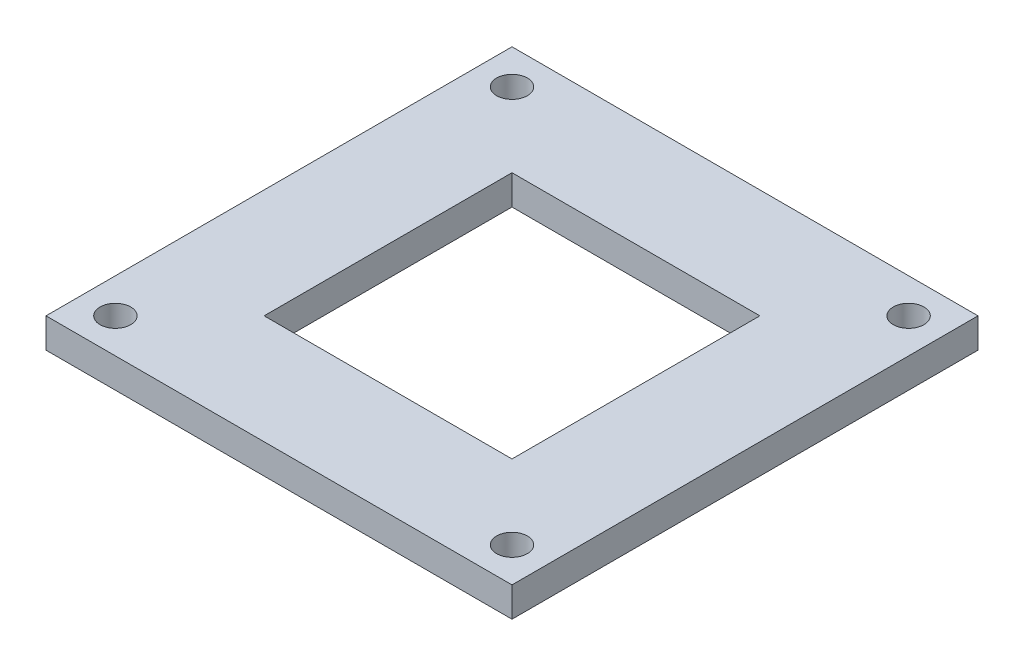
ISO-10303-21;
HEADER;
FILE_DESCRIPTION(('STEP AP214'),'2;1');
FILE_NAME('part.step','',(''),(''),'','','');
FILE_SCHEMA(('AUTOMOTIVE_DESIGN { 1 0 10303 214 1 1 1 1 }'));
ENDSEC;
DATA;
#1=APPLICATION_CONTEXT('core data for automotive mechanical design processes');
#2=APPLICATION_PROTOCOL_DEFINITION('international standard','automotive_design',2000,#1);
#3=PRODUCT_CONTEXT('',#1,'mechanical');
#4=PRODUCT('Part','Part','',(#3));
#5=PRODUCT_RELATED_PRODUCT_CATEGORY('part','',(#4));
#6=PRODUCT_DEFINITION_FORMATION('','',#4);
#7=PRODUCT_DEFINITION_CONTEXT('part definition',#1,'design');
#8=PRODUCT_DEFINITION('design','',#6,#7);
#9=PRODUCT_DEFINITION_SHAPE('','',#8);
#10=(LENGTH_UNIT() NAMED_UNIT(*) SI_UNIT(.MILLI.,.METRE.));
#11=(NAMED_UNIT(*) PLANE_ANGLE_UNIT() SI_UNIT($,.RADIAN.));
#12=(NAMED_UNIT(*) SI_UNIT($,.STERADIAN.) SOLID_ANGLE_UNIT());
#13=UNCERTAINTY_MEASURE_WITH_UNIT(LENGTH_MEASURE(1.E-05),#10,'distance_accuracy_value','');
#14=(GEOMETRIC_REPRESENTATION_CONTEXT(3) GLOBAL_UNCERTAINTY_ASSIGNED_CONTEXT((#13)) GLOBAL_UNIT_ASSIGNED_CONTEXT((#10,
#11,#12)) REPRESENTATION_CONTEXT('',''));
#15=CARTESIAN_POINT('',(0.,0.,0.));
#16=DIRECTION('',(0.,0.,1.));
#17=DIRECTION('',(1.,0.,0.));
#18=AXIS2_PLACEMENT_3D('',#15,#16,#17);
#19=CARTESIAN_POINT('',(23.5,3.,-23.5));
#20=DIRECTION('',(-1.,0.,0.));
#21=DIRECTION('',(0.,0.,1.));
#22=AXIS2_PLACEMENT_3D('',#19,#20,#21);
#23=PLANE('',#22);
#24=DIRECTION('',(0.,0.,-1.));
#25=VECTOR('',#24,1.);
#26=CARTESIAN_POINT('',(23.5,0.,-23.5));
#27=LINE('',#26,#25);
#28=CARTESIAN_POINT('',(23.5,0.,23.5));
#29=VERTEX_POINT('',#28);
#30=CARTESIAN_POINT('',(23.5,0.,-23.5));
#31=VERTEX_POINT('',#30);
#32=EDGE_CURVE('E134',#29,#31,#27,.T.);
#33=ORIENTED_EDGE('',*,*,#32,.T.);
#34=DIRECTION('',(0.,-1.,0.));
#35=VECTOR('',#34,1.);
#36=CARTESIAN_POINT('',(23.5,3.,-23.5));
#37=LINE('',#36,#35);
#38=CARTESIAN_POINT('',(23.5,3.,-23.5));
#39=VERTEX_POINT('',#38);
#40=EDGE_CURVE('E11',#39,#31,#37,.T.);
#41=ORIENTED_EDGE('',*,*,#40,.F.);
#42=DIRECTION('',(0.,0.,-1.));
#43=VECTOR('',#42,1.);
#44=CARTESIAN_POINT('',(23.5,3.,-23.5));
#45=LINE('',#44,#43);
#46=CARTESIAN_POINT('',(23.5,3.,23.5));
#47=VERTEX_POINT('',#46);
#48=EDGE_CURVE('E138',#47,#39,#45,.T.);
#49=ORIENTED_EDGE('',*,*,#48,.F.);
#50=DIRECTION('',(0.,-1.,0.));
#51=VECTOR('',#50,1.);
#52=CARTESIAN_POINT('',(23.5,3.,23.5));
#53=LINE('',#52,#51);
#54=EDGE_CURVE('E148',#47,#29,#53,.T.);
#55=ORIENTED_EDGE('',*,*,#54,.T.);
#56=EDGE_LOOP('',(#33,#41,#49,#55));
#57=FACE_BOUND('',#56,.T.);
#58=ADVANCED_FACE('F33',(#57),#23,.F.);
#59=CARTESIAN_POINT('',(-23.5,3.,-23.5));
#60=DIRECTION('',(0.,0.,1.));
#61=DIRECTION('',(1.,0.,0.));
#62=AXIS2_PLACEMENT_3D('',#59,#60,#61);
#63=PLANE('',#62);
#64=DIRECTION('',(-1.,0.,0.));
#65=VECTOR('',#64,1.);
#66=CARTESIAN_POINT('',(-23.5,0.,-23.5));
#67=LINE('',#66,#65);
#68=CARTESIAN_POINT('',(-23.5,0.,-23.5));
#69=VERTEX_POINT('',#68);
#70=EDGE_CURVE('E151',#31,#69,#67,.T.);
#71=ORIENTED_EDGE('',*,*,#70,.T.);
#72=DIRECTION('',(0.,-1.,0.));
#73=VECTOR('',#72,1.);
#74=CARTESIAN_POINT('',(-23.5,3.,-23.5));
#75=LINE('',#74,#73);
#76=CARTESIAN_POINT('',(-23.5,3.,-23.5));
#77=VERTEX_POINT('',#76);
#78=EDGE_CURVE('E40',#77,#69,#75,.T.);
#79=ORIENTED_EDGE('',*,*,#78,.F.);
#80=DIRECTION('',(-1.,0.,0.));
#81=VECTOR('',#80,1.);
#82=CARTESIAN_POINT('',(-23.5,3.,-23.5));
#83=LINE('',#82,#81);
#84=EDGE_CURVE('E141',#39,#77,#83,.T.);
#85=ORIENTED_EDGE('',*,*,#84,.F.);
#86=ORIENTED_EDGE('',*,*,#40,.T.);
#87=EDGE_LOOP('',(#71,#79,#85,#86));
#88=FACE_BOUND('',#87,.T.);
#89=ADVANCED_FACE('F179',(#88),#63,.F.);
#90=CARTESIAN_POINT('',(-23.5,3.,-23.5));
#91=DIRECTION('',(1.,0.,0.));
#92=DIRECTION('',(0.,0.,-1.));
#93=AXIS2_PLACEMENT_3D('',#90,#91,#92);
#94=PLANE('',#93);
#95=DIRECTION('',(0.,0.,1.));
#96=VECTOR('',#95,1.);
#97=CARTESIAN_POINT('',(-23.5,0.,-23.5));
#98=LINE('',#97,#96);
#99=CARTESIAN_POINT('',(-23.5,0.,23.5));
#100=VERTEX_POINT('',#99);
#101=EDGE_CURVE('E153',#69,#100,#98,.T.);
#102=ORIENTED_EDGE('',*,*,#101,.T.);
#103=DIRECTION('',(0.,-1.,0.));
#104=VECTOR('',#103,1.);
#105=CARTESIAN_POINT('',(-23.5,3.,23.5));
#106=LINE('',#105,#104);
#107=CARTESIAN_POINT('',(-23.5,3.,23.5));
#108=VERTEX_POINT('',#107);
#109=EDGE_CURVE('E158',#108,#100,#106,.T.);
#110=ORIENTED_EDGE('',*,*,#109,.F.);
#111=DIRECTION('',(0.,0.,1.));
#112=VECTOR('',#111,1.);
#113=CARTESIAN_POINT('',(-23.5,3.,-23.5));
#114=LINE('',#113,#112);
#115=EDGE_CURVE('E144',#77,#108,#114,.T.);
#116=ORIENTED_EDGE('',*,*,#115,.F.);
#117=ORIENTED_EDGE('',*,*,#78,.T.);
#118=EDGE_LOOP('',(#102,#110,#116,#117));
#119=FACE_BOUND('',#118,.T.);
#120=ADVANCED_FACE('F165',(#119),#94,.F.);
#121=CARTESIAN_POINT('',(-23.5,3.,23.5));
#122=DIRECTION('',(0.,0.,-1.));
#123=DIRECTION('',(-1.,0.,0.));
#124=AXIS2_PLACEMENT_3D('',#121,#122,#123);
#125=PLANE('',#124);
#126=DIRECTION('',(1.,0.,0.));
#127=VECTOR('',#126,1.);
#128=CARTESIAN_POINT('',(-23.5,0.,23.5));
#129=LINE('',#128,#127);
#130=EDGE_CURVE('E142',#100,#29,#129,.T.);
#131=ORIENTED_EDGE('',*,*,#130,.T.);
#132=ORIENTED_EDGE('',*,*,#54,.F.);
#133=DIRECTION('',(1.,0.,0.));
#134=VECTOR('',#133,1.);
#135=CARTESIAN_POINT('',(-23.5,3.,23.5));
#136=LINE('',#135,#134);
#137=EDGE_CURVE('E146',#108,#47,#136,.T.);
#138=ORIENTED_EDGE('',*,*,#137,.F.);
#139=ORIENTED_EDGE('',*,*,#109,.T.);
#140=EDGE_LOOP('',(#131,#132,#138,#139));
#141=FACE_BOUND('',#140,.T.);
#142=ADVANCED_FACE('F172',(#141),#125,.F.);
#143=CARTESIAN_POINT('',(0.,3.,0.));
#144=DIRECTION('',(0.,1.,0.));
#145=DIRECTION('',(0.,0.,1.));
#146=AXIS2_PLACEMENT_3D('',#143,#144,#145);
#147=PLANE('',#146);
#148=CARTESIAN_POINT('',(-20.,3.,20.));
#149=DIRECTION('',(0.,-1.,0.));
#150=DIRECTION('',(0.,0.,1.));
#151=AXIS2_PLACEMENT_3D('',#148,#149,#150);
#152=CIRCLE('',#151,1.55);
#153=CARTESIAN_POINT('',(-20.,3.,21.55));
#154=VERTEX_POINT('',#153);
#155=EDGE_CURVE('E235',#154,#154,#152,.T.);
#156=ORIENTED_EDGE('',*,*,#155,.T.);
#157=EDGE_LOOP('',(#156));
#158=FACE_BOUND('',#157,.T.);
#159=CARTESIAN_POINT('',(20.,3.,-20.));
#160=DIRECTION('',(0.,-1.,0.));
#161=DIRECTION('',(0.,0.,1.));
#162=AXIS2_PLACEMENT_3D('',#159,#160,#161);
#163=CIRCLE('',#162,1.55);
#164=CARTESIAN_POINT('',(20.,3.,-18.45));
#165=VERTEX_POINT('',#164);
#166=EDGE_CURVE('E241',#165,#165,#163,.T.);
#167=ORIENTED_EDGE('',*,*,#166,.T.);
#168=EDGE_LOOP('',(#167));
#169=FACE_BOUND('',#168,.T.);
#170=CARTESIAN_POINT('',(-20.,3.,-20.));
#171=DIRECTION('',(0.,-1.,0.));
#172=DIRECTION('',(0.,0.,-1.));
#173=AXIS2_PLACEMENT_3D('',#170,#171,#172);
#174=CIRCLE('',#173,1.55);
#175=CARTESIAN_POINT('',(-20.,3.,-21.55));
#176=VERTEX_POINT('',#175);
#177=EDGE_CURVE('E226',#176,#176,#174,.T.);
#178=ORIENTED_EDGE('',*,*,#177,.T.);
#179=EDGE_LOOP('',(#178));
#180=FACE_BOUND('',#179,.T.);
#181=CARTESIAN_POINT('',(20.,3.,20.));
#182=DIRECTION('',(0.,-1.,0.));
#183=DIRECTION('',(0.,0.,-1.));
#184=AXIS2_PLACEMENT_3D('',#181,#182,#183);
#185=CIRCLE('',#184,1.55);
#186=CARTESIAN_POINT('',(20.,3.,18.45));
#187=VERTEX_POINT('',#186);
#188=EDGE_CURVE('E128',#187,#187,#185,.T.);
#189=ORIENTED_EDGE('',*,*,#188,.T.);
#190=EDGE_LOOP('',(#189));
#191=FACE_BOUND('',#190,.T.);
#192=DIRECTION('',(0.,0.,-1.));
#193=VECTOR('',#192,1.);
#194=CARTESIAN_POINT('',(12.5,3.,12.5));
#195=LINE('',#194,#193);
#196=CARTESIAN_POINT('',(12.5,3.,12.5));
#197=VERTEX_POINT('',#196);
#198=CARTESIAN_POINT('',(12.5,3.,-12.5));
#199=VERTEX_POINT('',#198);
#200=EDGE_CURVE('E47',#197,#199,#195,.T.);
#201=ORIENTED_EDGE('',*,*,#200,.F.);
#202=DIRECTION('',(1.,0.,0.));
#203=VECTOR('',#202,1.);
#204=CARTESIAN_POINT('',(-12.5,3.,12.5));
#205=LINE('',#204,#203);
#206=CARTESIAN_POINT('',(-12.5,3.,12.5));
#207=VERTEX_POINT('',#206);
#208=EDGE_CURVE('E115',#207,#197,#205,.T.);
#209=ORIENTED_EDGE('',*,*,#208,.F.);
#210=DIRECTION('',(0.,0.,1.));
#211=VECTOR('',#210,1.);
#212=CARTESIAN_POINT('',(-12.5,3.,12.5));
#213=LINE('',#212,#211);
#214=CARTESIAN_POINT('',(-12.5,3.,-12.5));
#215=VERTEX_POINT('',#214);
#216=EDGE_CURVE('E118',#215,#207,#213,.T.);
#217=ORIENTED_EDGE('',*,*,#216,.F.);
#218=DIRECTION('',(-1.,0.,0.));
#219=VECTOR('',#218,1.);
#220=CARTESIAN_POINT('',(-12.5,3.,-12.5));
#221=LINE('',#220,#219);
#222=EDGE_CURVE('E127',#199,#215,#221,.T.);
#223=ORIENTED_EDGE('',*,*,#222,.F.);
#224=EDGE_LOOP('',(#201,#209,#217,#223));
#225=FACE_BOUND('',#224,.T.);
#226=ORIENTED_EDGE('',*,*,#48,.T.);
#227=ORIENTED_EDGE('',*,*,#84,.T.);
#228=ORIENTED_EDGE('',*,*,#115,.T.);
#229=ORIENTED_EDGE('',*,*,#137,.T.);
#230=EDGE_LOOP('',(#226,#227,#228,#229));
#231=FACE_BOUND('',#230,.T.);
#232=ADVANCED_FACE('F178',(#158,#169,#180,#191,#225,#231),#147,.T.);
#233=CARTESIAN_POINT('',(0.,0.,0.));
#234=DIRECTION('',(0.,1.,0.));
#235=DIRECTION('',(0.,0.,1.));
#236=AXIS2_PLACEMENT_3D('',#233,#234,#235);
#237=PLANE('',#236);
#238=CARTESIAN_POINT('',(-20.,0.,20.));
#239=DIRECTION('',(0.,-1.,0.));
#240=DIRECTION('',(0.,0.,1.));
#241=AXIS2_PLACEMENT_3D('',#238,#239,#240);
#242=CIRCLE('',#241,1.55);
#243=CARTESIAN_POINT('',(-20.,0.,21.55));
#244=VERTEX_POINT('',#243);
#245=EDGE_CURVE('E238',#244,#244,#242,.T.);
#246=ORIENTED_EDGE('',*,*,#245,.F.);
#247=EDGE_LOOP('',(#246));
#248=FACE_BOUND('',#247,.T.);
#249=CARTESIAN_POINT('',(20.,0.,-20.));
#250=DIRECTION('',(0.,-1.,0.));
#251=DIRECTION('',(0.,0.,1.));
#252=AXIS2_PLACEMENT_3D('',#249,#250,#251);
#253=CIRCLE('',#252,1.55);
#254=CARTESIAN_POINT('',(20.,0.,-18.45));
#255=VERTEX_POINT('',#254);
#256=EDGE_CURVE('E232',#255,#255,#253,.T.);
#257=ORIENTED_EDGE('',*,*,#256,.F.);
#258=EDGE_LOOP('',(#257));
#259=FACE_BOUND('',#258,.T.);
#260=CARTESIAN_POINT('',(-20.,0.,-20.));
#261=DIRECTION('',(0.,-1.,0.));
#262=DIRECTION('',(0.,0.,-1.));
#263=AXIS2_PLACEMENT_3D('',#260,#261,#262);
#264=CIRCLE('',#263,1.55);
#265=CARTESIAN_POINT('',(-20.,0.,-21.55));
#266=VERTEX_POINT('',#265);
#267=EDGE_CURVE('E229',#266,#266,#264,.T.);
#268=ORIENTED_EDGE('',*,*,#267,.F.);
#269=EDGE_LOOP('',(#268));
#270=FACE_BOUND('',#269,.T.);
#271=CARTESIAN_POINT('',(20.,0.,20.));
#272=DIRECTION('',(0.,-1.,0.));
#273=DIRECTION('',(0.,0.,-1.));
#274=AXIS2_PLACEMENT_3D('',#271,#272,#273);
#275=CIRCLE('',#274,1.55);
#276=CARTESIAN_POINT('',(20.,0.,18.45));
#277=VERTEX_POINT('',#276);
#278=EDGE_CURVE('E121',#277,#277,#275,.T.);
#279=ORIENTED_EDGE('',*,*,#278,.F.);
#280=EDGE_LOOP('',(#279));
#281=FACE_BOUND('',#280,.T.);
#282=DIRECTION('',(1.,0.,0.));
#283=VECTOR('',#282,1.);
#284=CARTESIAN_POINT('',(-12.5,0.,12.5));
#285=LINE('',#284,#283);
#286=CARTESIAN_POINT('',(-12.5,0.,12.5));
#287=VERTEX_POINT('',#286);
#288=CARTESIAN_POINT('',(12.5,0.,12.5));
#289=VERTEX_POINT('',#288);
#290=EDGE_CURVE('E105',#287,#289,#285,.T.);
#291=ORIENTED_EDGE('',*,*,#290,.T.);
#292=DIRECTION('',(0.,0.,-1.));
#293=VECTOR('',#292,1.);
#294=CARTESIAN_POINT('',(12.5,0.,12.5));
#295=LINE('',#294,#293);
#296=CARTESIAN_POINT('',(12.5,0.,-12.5));
#297=VERTEX_POINT('',#296);
#298=EDGE_CURVE('E99',#289,#297,#295,.T.);
#299=ORIENTED_EDGE('',*,*,#298,.T.);
#300=DIRECTION('',(-1.,0.,0.));
#301=VECTOR('',#300,1.);
#302=CARTESIAN_POINT('',(-12.5,0.,-12.5));
#303=LINE('',#302,#301);
#304=CARTESIAN_POINT('',(-12.5,0.,-12.5));
#305=VERTEX_POINT('',#304);
#306=EDGE_CURVE('E108',#297,#305,#303,.T.);
#307=ORIENTED_EDGE('',*,*,#306,.T.);
#308=DIRECTION('',(0.,0.,1.));
#309=VECTOR('',#308,1.);
#310=CARTESIAN_POINT('',(-12.5,0.,12.5));
#311=LINE('',#310,#309);
#312=EDGE_CURVE('E55',#305,#287,#311,.T.);
#313=ORIENTED_EDGE('',*,*,#312,.T.);
#314=EDGE_LOOP('',(#291,#299,#307,#313));
#315=FACE_BOUND('',#314,.T.);
#316=ORIENTED_EDGE('',*,*,#32,.F.);
#317=ORIENTED_EDGE('',*,*,#130,.F.);
#318=ORIENTED_EDGE('',*,*,#101,.F.);
#319=ORIENTED_EDGE('',*,*,#70,.F.);
#320=EDGE_LOOP('',(#316,#317,#318,#319));
#321=FACE_BOUND('',#320,.T.);
#322=ADVANCED_FACE('F112',(#248,#259,#270,#281,#315,#321),#237,.F.);
#323=CARTESIAN_POINT('',(12.5,0.,12.5));
#324=DIRECTION('',(1.,0.,0.));
#325=DIRECTION('',(0.,0.,-1.));
#326=AXIS2_PLACEMENT_3D('',#323,#324,#325);
#327=PLANE('',#326);
#328=ORIENTED_EDGE('',*,*,#200,.T.);
#329=DIRECTION('',(0.,1.,0.));
#330=VECTOR('',#329,1.);
#331=CARTESIAN_POINT('',(12.5,0.,-12.5));
#332=LINE('',#331,#330);
#333=EDGE_CURVE('E95',#297,#199,#332,.T.);
#334=ORIENTED_EDGE('',*,*,#333,.F.);
#335=ORIENTED_EDGE('',*,*,#298,.F.);
#336=DIRECTION('',(0.,1.,0.));
#337=VECTOR('',#336,1.);
#338=CARTESIAN_POINT('',(12.5,0.,12.5));
#339=LINE('',#338,#337);
#340=EDGE_CURVE('E132',#289,#197,#339,.T.);
#341=ORIENTED_EDGE('',*,*,#340,.T.);
#342=EDGE_LOOP('',(#328,#334,#335,#341));
#343=FACE_BOUND('',#342,.T.);
#344=ADVANCED_FACE('F97',(#343),#327,.F.);
#345=CARTESIAN_POINT('',(-12.5,0.,12.5));
#346=DIRECTION('',(0.,0.,1.));
#347=DIRECTION('',(1.,0.,0.));
#348=AXIS2_PLACEMENT_3D('',#345,#346,#347);
#349=PLANE('',#348);
#350=ORIENTED_EDGE('',*,*,#208,.T.);
#351=ORIENTED_EDGE('',*,*,#340,.F.);
#352=ORIENTED_EDGE('',*,*,#290,.F.);
#353=DIRECTION('',(0.,1.,0.));
#354=VECTOR('',#353,1.);
#355=CARTESIAN_POINT('',(-12.5,0.,12.5));
#356=LINE('',#355,#354);
#357=EDGE_CURVE('E135',#287,#207,#356,.T.);
#358=ORIENTED_EDGE('',*,*,#357,.T.);
#359=EDGE_LOOP('',(#350,#351,#352,#358));
#360=FACE_BOUND('',#359,.T.);
#361=ADVANCED_FACE('F197',(#360),#349,.F.);
#362=CARTESIAN_POINT('',(-12.5,0.,12.5));
#363=DIRECTION('',(-1.,0.,0.));
#364=DIRECTION('',(0.,0.,1.));
#365=AXIS2_PLACEMENT_3D('',#362,#363,#364);
#366=PLANE('',#365);
#367=ORIENTED_EDGE('',*,*,#216,.T.);
#368=ORIENTED_EDGE('',*,*,#357,.F.);
#369=ORIENTED_EDGE('',*,*,#312,.F.);
#370=DIRECTION('',(0.,1.,0.));
#371=VECTOR('',#370,1.);
#372=CARTESIAN_POINT('',(-12.5,0.,-12.5));
#373=LINE('',#372,#371);
#374=EDGE_CURVE('E104',#305,#215,#373,.T.);
#375=ORIENTED_EDGE('',*,*,#374,.T.);
#376=EDGE_LOOP('',(#367,#368,#369,#375));
#377=FACE_BOUND('',#376,.T.);
#378=ADVANCED_FACE('F201',(#377),#366,.F.);
#379=CARTESIAN_POINT('',(-12.5,0.,-12.5));
#380=DIRECTION('',(0.,0.,-1.));
#381=DIRECTION('',(-1.,0.,0.));
#382=AXIS2_PLACEMENT_3D('',#379,#380,#381);
#383=PLANE('',#382);
#384=ORIENTED_EDGE('',*,*,#222,.T.);
#385=ORIENTED_EDGE('',*,*,#374,.F.);
#386=ORIENTED_EDGE('',*,*,#306,.F.);
#387=ORIENTED_EDGE('',*,*,#333,.T.);
#388=EDGE_LOOP('',(#384,#385,#386,#387));
#389=FACE_BOUND('',#388,.T.);
#390=ADVANCED_FACE('F109',(#389),#383,.F.);
#391=CARTESIAN_POINT('',(20.,3.,20.));
#392=DIRECTION('',(0.,-1.,0.));
#393=DIRECTION('',(0.,0.,-1.));
#394=AXIS2_PLACEMENT_3D('',#391,#392,#393);
#395=CYLINDRICAL_SURFACE('',#394,1.55);
#396=ORIENTED_EDGE('',*,*,#188,.F.);
#397=EDGE_LOOP('',(#396));
#398=FACE_BOUND('',#397,.T.);
#399=ORIENTED_EDGE('',*,*,#278,.T.);
#400=EDGE_LOOP('',(#399));
#401=FACE_BOUND('',#400,.T.);
#402=ADVANCED_FACE('F200',(#398,#401),#395,.F.);
#403=CARTESIAN_POINT('',(-20.,3.,-20.));
#404=DIRECTION('',(0.,-1.,0.));
#405=DIRECTION('',(0.,0.,-1.));
#406=AXIS2_PLACEMENT_3D('',#403,#404,#405);
#407=CYLINDRICAL_SURFACE('',#406,1.55);
#408=ORIENTED_EDGE('',*,*,#177,.F.);
#409=EDGE_LOOP('',(#408));
#410=FACE_BOUND('',#409,.T.);
#411=ORIENTED_EDGE('',*,*,#267,.T.);
#412=EDGE_LOOP('',(#411));
#413=FACE_BOUND('',#412,.T.);
#414=ADVANCED_FACE('F209',(#410,#413),#407,.F.);
#415=CARTESIAN_POINT('',(20.,3.,-20.));
#416=DIRECTION('',(0.,-1.,0.));
#417=DIRECTION('',(0.,0.,-1.));
#418=AXIS2_PLACEMENT_3D('',#415,#416,#417);
#419=CYLINDRICAL_SURFACE('',#418,1.55);
#420=ORIENTED_EDGE('',*,*,#166,.F.);
#421=EDGE_LOOP('',(#420));
#422=FACE_BOUND('',#421,.T.);
#423=ORIENTED_EDGE('',*,*,#256,.T.);
#424=EDGE_LOOP('',(#423));
#425=FACE_BOUND('',#424,.T.);
#426=ADVANCED_FACE('F211',(#422,#425),#419,.F.);
#427=CARTESIAN_POINT('',(-20.,3.,20.));
#428=DIRECTION('',(0.,-1.,0.));
#429=DIRECTION('',(0.,0.,-1.));
#430=AXIS2_PLACEMENT_3D('',#427,#428,#429);
#431=CYLINDRICAL_SURFACE('',#430,1.55);
#432=ORIENTED_EDGE('',*,*,#155,.F.);
#433=EDGE_LOOP('',(#432));
#434=FACE_BOUND('',#433,.T.);
#435=ORIENTED_EDGE('',*,*,#245,.T.);
#436=EDGE_LOOP('',(#435));
#437=FACE_BOUND('',#436,.T.);
#438=ADVANCED_FACE('F214',(#434,#437),#431,.F.);
#439=CLOSED_SHELL('',(#58,#89,#120,#142,#232,#322,#344,#361,#378,#390,#402,#414,#426,#438));
#440=MANIFOLD_SOLID_BREP('B2',#439);
#441=ADVANCED_BREP_SHAPE_REPRESENTATION('',(#18,#440),#14);
#442=SHAPE_DEFINITION_REPRESENTATION(#9,#441);
ENDSEC;
END-ISO-10303-21;
